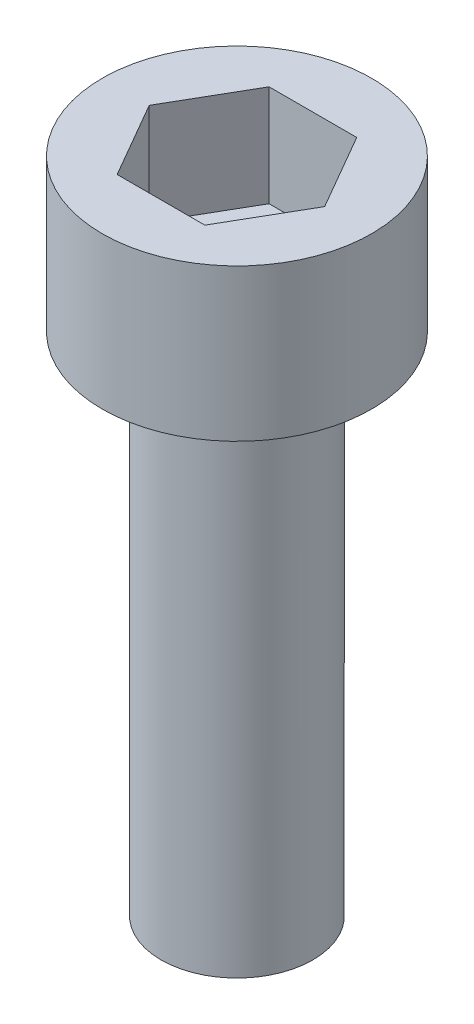
ISO-10303-21;
HEADER;
FILE_DESCRIPTION(('STEP AP214'),'2;1');
FILE_NAME('part.step','',(''),(''),'','','');
FILE_SCHEMA(('AUTOMOTIVE_DESIGN { 1 0 10303 214 1 1 1 1 }'));
ENDSEC;
DATA;
#1=APPLICATION_CONTEXT('core data for automotive mechanical design processes');
#2=APPLICATION_PROTOCOL_DEFINITION('international standard','automotive_design',2000,#1);
#3=PRODUCT_CONTEXT('',#1,'mechanical');
#4=PRODUCT('Part','Part','',(#3));
#5=PRODUCT_RELATED_PRODUCT_CATEGORY('part','',(#4));
#6=PRODUCT_DEFINITION_FORMATION('','',#4);
#7=PRODUCT_DEFINITION_CONTEXT('part definition',#1,'design');
#8=PRODUCT_DEFINITION('design','',#6,#7);
#9=PRODUCT_DEFINITION_SHAPE('','',#8);
#10=(LENGTH_UNIT() NAMED_UNIT(*) SI_UNIT(.MILLI.,.METRE.));
#11=(NAMED_UNIT(*) PLANE_ANGLE_UNIT() SI_UNIT($,.RADIAN.));
#12=(NAMED_UNIT(*) SI_UNIT($,.STERADIAN.) SOLID_ANGLE_UNIT());
#13=UNCERTAINTY_MEASURE_WITH_UNIT(LENGTH_MEASURE(1.E-05),#10,'distance_accuracy_value','');
#14=(GEOMETRIC_REPRESENTATION_CONTEXT(3) GLOBAL_UNCERTAINTY_ASSIGNED_CONTEXT((#13)) GLOBAL_UNIT_ASSIGNED_CONTEXT((#10,
#11,#12)) REPRESENTATION_CONTEXT('',''));
#15=CARTESIAN_POINT('',(0.,0.,0.));
#16=DIRECTION('',(0.,0.,1.));
#17=DIRECTION('',(1.,0.,0.));
#18=AXIS2_PLACEMENT_3D('',#15,#16,#17);
#19=CARTESIAN_POINT('',(0.,3.,0.));
#20=DIRECTION('',(0.,-1.,0.));
#21=DIRECTION('',(0.,0.,-1.));
#22=AXIS2_PLACEMENT_3D('',#19,#20,#21);
#23=CYLINDRICAL_SURFACE('',#22,2.66);
#24=CARTESIAN_POINT('',(0.,3.,0.));
#25=DIRECTION('',(0.,1.,0.));
#26=DIRECTION('',(0.,0.,1.));
#27=AXIS2_PLACEMENT_3D('',#24,#25,#26);
#28=CIRCLE('',#27,2.66);
#29=CARTESIAN_POINT('',(0.,3.,2.66));
#30=VERTEX_POINT('',#29);
#31=EDGE_CURVE('E42',#30,#30,#28,.T.);
#32=ORIENTED_EDGE('',*,*,#31,.F.);
#33=EDGE_LOOP('',(#32));
#34=FACE_BOUND('',#33,.T.);
#35=CARTESIAN_POINT('',(0.,0.,0.));
#36=DIRECTION('',(0.,1.,0.));
#37=DIRECTION('',(0.,0.,1.));
#38=AXIS2_PLACEMENT_3D('',#35,#36,#37);
#39=CIRCLE('',#38,2.66);
#40=CARTESIAN_POINT('',(0.,0.,2.66));
#41=VERTEX_POINT('',#40);
#42=EDGE_CURVE('E137',#41,#41,#39,.T.);
#43=ORIENTED_EDGE('',*,*,#42,.T.);
#44=EDGE_LOOP('',(#43));
#45=FACE_BOUND('',#44,.T.);
#46=ADVANCED_FACE('F35',(#34,#45),#23,.T.);
#47=CARTESIAN_POINT('',(0.,3.,0.));
#48=DIRECTION('',(0.,1.,0.));
#49=DIRECTION('',(0.,0.,1.));
#50=AXIS2_PLACEMENT_3D('',#47,#48,#49);
#51=PLANE('',#50);
#52=DIRECTION('',(0.5,0.,-0.866025403784439));
#53=VECTOR('',#52,1.);
#54=CARTESIAN_POINT('',(0.866025403784438,3.,1.5));
#55=LINE('',#54,#53);
#56=CARTESIAN_POINT('',(0.866025403784438,3.,1.5));
#57=VERTEX_POINT('',#56);
#58=CARTESIAN_POINT('',(1.73205080756888,3.,0.));
#59=VERTEX_POINT('',#58);
#60=EDGE_CURVE('E49',#57,#59,#55,.T.);
#61=ORIENTED_EDGE('',*,*,#60,.F.);
#62=DIRECTION('',(1.,0.,0.));
#63=VECTOR('',#62,1.);
#64=CARTESIAN_POINT('',(-0.866025403784439,3.,1.5));
#65=LINE('',#64,#63);
#66=CARTESIAN_POINT('',(-0.866025403784439,3.,1.5));
#67=VERTEX_POINT('',#66);
#68=EDGE_CURVE('E133',#67,#57,#65,.T.);
#69=ORIENTED_EDGE('',*,*,#68,.F.);
#70=DIRECTION('',(0.5,0.,0.866025403784439));
#71=VECTOR('',#70,1.);
#72=CARTESIAN_POINT('',(-1.73205080756888,3.,0.));
#73=LINE('',#72,#71);
#74=CARTESIAN_POINT('',(-1.73205080756888,3.,0.));
#75=VERTEX_POINT('',#74);
#76=EDGE_CURVE('E131',#75,#67,#73,.T.);
#77=ORIENTED_EDGE('',*,*,#76,.F.);
#78=DIRECTION('',(-0.5,0.,0.866025403784439));
#79=VECTOR('',#78,1.);
#80=CARTESIAN_POINT('',(-0.866025403784439,3.,-1.5));
#81=LINE('',#80,#79);
#82=CARTESIAN_POINT('',(-0.866025403784439,3.,-1.5));
#83=VERTEX_POINT('',#82);
#84=EDGE_CURVE('E97',#83,#75,#81,.T.);
#85=ORIENTED_EDGE('',*,*,#84,.F.);
#86=DIRECTION('',(-1.,0.,0.));
#87=VECTOR('',#86,1.);
#88=CARTESIAN_POINT('',(0.866025403784438,3.,-1.5));
#89=LINE('',#88,#87);
#90=CARTESIAN_POINT('',(0.866025403784438,3.,-1.5));
#91=VERTEX_POINT('',#90);
#92=EDGE_CURVE('E127',#91,#83,#89,.T.);
#93=ORIENTED_EDGE('',*,*,#92,.F.);
#94=DIRECTION('',(-0.5,0.,-0.866025403784439));
#95=VECTOR('',#94,1.);
#96=CARTESIAN_POINT('',(1.73205080756888,3.,0.));
#97=LINE('',#96,#95);
#98=EDGE_CURVE('E123',#59,#91,#97,.T.);
#99=ORIENTED_EDGE('',*,*,#98,.F.);
#100=EDGE_LOOP('',(#61,#69,#77,#85,#93,#99));
#101=FACE_BOUND('',#100,.T.);
#102=ORIENTED_EDGE('',*,*,#31,.T.);
#103=EDGE_LOOP('',(#102));
#104=FACE_BOUND('',#103,.T.);
#105=ADVANCED_FACE('F151',(#101,#104),#51,.T.);
#106=CARTESIAN_POINT('',(0.,0.,0.));
#107=DIRECTION('',(0.,1.,0.));
#108=DIRECTION('',(0.,0.,1.));
#109=AXIS2_PLACEMENT_3D('',#106,#107,#108);
#110=PLANE('',#109);
#111=CARTESIAN_POINT('',(0.,0.,0.));
#112=DIRECTION('',(0.,1.,0.));
#113=DIRECTION('',(0.,0.,1.));
#114=AXIS2_PLACEMENT_3D('',#111,#112,#113);
#115=CIRCLE('',#114,1.5);
#116=CARTESIAN_POINT('',(0.,0.,1.5));
#117=VERTEX_POINT('',#116);
#118=EDGE_CURVE('E11',#117,#117,#115,.F.);
#119=ORIENTED_EDGE('',*,*,#118,.F.);
#120=EDGE_LOOP('',(#119));
#121=FACE_BOUND('',#120,.T.);
#122=ORIENTED_EDGE('',*,*,#42,.F.);
#123=EDGE_LOOP('',(#122));
#124=FACE_BOUND('',#123,.T.);
#125=ADVANCED_FACE('F148',(#121,#124),#110,.F.);
#126=CARTESIAN_POINT('',(0.866025403784438,1.,1.5));
#127=DIRECTION('',(0.866025403784439,0.,0.5));
#128=DIRECTION('',(0.5,0.,-0.866025403784439));
#129=AXIS2_PLACEMENT_3D('',#126,#127,#128);
#130=PLANE('',#129);
#131=ORIENTED_EDGE('',*,*,#60,.T.);
#132=DIRECTION('',(0.,1.,0.));
#133=VECTOR('',#132,1.);
#134=CARTESIAN_POINT('',(1.73205080756888,1.,0.));
#135=LINE('',#134,#133);
#136=CARTESIAN_POINT('',(1.73205080756888,1.,0.));
#137=VERTEX_POINT('',#136);
#138=EDGE_CURVE('E79',#137,#59,#135,.T.);
#139=ORIENTED_EDGE('',*,*,#138,.F.);
#140=DIRECTION('',(0.5,0.,-0.866025403784439));
#141=VECTOR('',#140,1.);
#142=CARTESIAN_POINT('',(0.866025403784438,1.,1.5));
#143=LINE('',#142,#141);
#144=CARTESIAN_POINT('',(0.866025403784438,1.,1.5));
#145=VERTEX_POINT('',#144);
#146=EDGE_CURVE('E135',#145,#137,#143,.T.);
#147=ORIENTED_EDGE('',*,*,#146,.F.);
#148=DIRECTION('',(0.,1.,0.));
#149=VECTOR('',#148,1.);
#150=CARTESIAN_POINT('',(0.866025403784438,1.,1.5));
#151=LINE('',#150,#149);
#152=EDGE_CURVE('E57',#145,#57,#151,.T.);
#153=ORIENTED_EDGE('',*,*,#152,.T.);
#154=EDGE_LOOP('',(#131,#139,#147,#153));
#155=FACE_BOUND('',#154,.T.);
#156=ADVANCED_FACE('F150',(#155),#130,.F.);
#157=CARTESIAN_POINT('',(-0.866025403784439,1.,1.5));
#158=DIRECTION('',(0.,0.,1.));
#159=DIRECTION('',(1.,0.,0.));
#160=AXIS2_PLACEMENT_3D('',#157,#158,#159);
#161=PLANE('',#160);
#162=ORIENTED_EDGE('',*,*,#68,.T.);
#163=ORIENTED_EDGE('',*,*,#152,.F.);
#164=DIRECTION('',(1.,0.,0.));
#165=VECTOR('',#164,1.);
#166=CARTESIAN_POINT('',(-0.866025403784439,1.,1.5));
#167=LINE('',#166,#165);
#168=CARTESIAN_POINT('',(-0.866025403784439,1.,1.5));
#169=VERTEX_POINT('',#168);
#170=EDGE_CURVE('E109',#169,#145,#167,.T.);
#171=ORIENTED_EDGE('',*,*,#170,.F.);
#172=DIRECTION('',(0.,1.,0.));
#173=VECTOR('',#172,1.);
#174=CARTESIAN_POINT('',(-0.866025403784439,1.,1.5));
#175=LINE('',#174,#173);
#176=EDGE_CURVE('E101',#169,#67,#175,.T.);
#177=ORIENTED_EDGE('',*,*,#176,.T.);
#178=EDGE_LOOP('',(#162,#163,#171,#177));
#179=FACE_BOUND('',#178,.T.);
#180=ADVANCED_FACE('F157',(#179),#161,.F.);
#181=CARTESIAN_POINT('',(-1.73205080756888,1.,0.));
#182=DIRECTION('',(-0.866025403784439,0.,0.5));
#183=DIRECTION('',(0.5,0.,0.866025403784439));
#184=AXIS2_PLACEMENT_3D('',#181,#182,#183);
#185=PLANE('',#184);
#186=ORIENTED_EDGE('',*,*,#76,.T.);
#187=ORIENTED_EDGE('',*,*,#176,.F.);
#188=DIRECTION('',(0.5,0.,0.866025403784439));
#189=VECTOR('',#188,1.);
#190=CARTESIAN_POINT('',(-1.73205080756888,1.,0.));
#191=LINE('',#190,#189);
#192=CARTESIAN_POINT('',(-1.73205080756888,1.,0.));
#193=VERTEX_POINT('',#192);
#194=EDGE_CURVE('E105',#193,#169,#191,.T.);
#195=ORIENTED_EDGE('',*,*,#194,.F.);
#196=DIRECTION('',(0.,1.,0.));
#197=VECTOR('',#196,1.);
#198=CARTESIAN_POINT('',(-1.73205080756888,1.,0.));
#199=LINE('',#198,#197);
#200=EDGE_CURVE('E90',#193,#75,#199,.T.);
#201=ORIENTED_EDGE('',*,*,#200,.T.);
#202=EDGE_LOOP('',(#186,#187,#195,#201));
#203=FACE_BOUND('',#202,.T.);
#204=ADVANCED_FACE('F106',(#203),#185,.F.);
#205=CARTESIAN_POINT('',(-0.866025403784439,1.,-1.5));
#206=DIRECTION('',(-0.866025403784439,0.,-0.5));
#207=DIRECTION('',(-0.5,0.,0.866025403784439));
#208=AXIS2_PLACEMENT_3D('',#205,#206,#207);
#209=PLANE('',#208);
#210=ORIENTED_EDGE('',*,*,#84,.T.);
#211=ORIENTED_EDGE('',*,*,#200,.F.);
#212=DIRECTION('',(-0.5,0.,0.866025403784439));
#213=VECTOR('',#212,1.);
#214=CARTESIAN_POINT('',(-0.866025403784439,1.,-1.5));
#215=LINE('',#214,#213);
#216=CARTESIAN_POINT('',(-0.866025403784439,1.,-1.5));
#217=VERTEX_POINT('',#216);
#218=EDGE_CURVE('E94',#217,#193,#215,.T.);
#219=ORIENTED_EDGE('',*,*,#218,.F.);
#220=DIRECTION('',(0.,1.,0.));
#221=VECTOR('',#220,1.);
#222=CARTESIAN_POINT('',(-0.866025403784439,1.,-1.5));
#223=LINE('',#222,#221);
#224=EDGE_CURVE('E102',#217,#83,#223,.T.);
#225=ORIENTED_EDGE('',*,*,#224,.T.);
#226=EDGE_LOOP('',(#210,#211,#219,#225));
#227=FACE_BOUND('',#226,.T.);
#228=ADVANCED_FACE('F92',(#227),#209,.F.);
#229=CARTESIAN_POINT('',(0.866025403784438,1.,-1.5));
#230=DIRECTION('',(0.,0.,-1.));
#231=DIRECTION('',(-1.,0.,0.));
#232=AXIS2_PLACEMENT_3D('',#229,#230,#231);
#233=PLANE('',#232);
#234=ORIENTED_EDGE('',*,*,#92,.T.);
#235=ORIENTED_EDGE('',*,*,#224,.F.);
#236=DIRECTION('',(-1.,0.,0.));
#237=VECTOR('',#236,1.);
#238=CARTESIAN_POINT('',(0.866025403784438,1.,-1.5));
#239=LINE('',#238,#237);
#240=CARTESIAN_POINT('',(0.866025403784438,1.,-1.5));
#241=VERTEX_POINT('',#240);
#242=EDGE_CURVE('E115',#241,#217,#239,.T.);
#243=ORIENTED_EDGE('',*,*,#242,.F.);
#244=DIRECTION('',(0.,1.,0.));
#245=VECTOR('',#244,1.);
#246=CARTESIAN_POINT('',(0.866025403784438,1.,-1.5));
#247=LINE('',#246,#245);
#248=EDGE_CURVE('E140',#241,#91,#247,.T.);
#249=ORIENTED_EDGE('',*,*,#248,.T.);
#250=EDGE_LOOP('',(#234,#235,#243,#249));
#251=FACE_BOUND('',#250,.T.);
#252=ADVANCED_FACE('F209',(#251),#233,.F.);
#253=CARTESIAN_POINT('',(1.73205080756888,1.,0.));
#254=DIRECTION('',(0.866025403784439,0.,-0.5));
#255=DIRECTION('',(-0.5,0.,-0.866025403784439));
#256=AXIS2_PLACEMENT_3D('',#253,#254,#255);
#257=PLANE('',#256);
#258=ORIENTED_EDGE('',*,*,#98,.T.);
#259=ORIENTED_EDGE('',*,*,#248,.F.);
#260=DIRECTION('',(-0.5,0.,-0.866025403784439));
#261=VECTOR('',#260,1.);
#262=CARTESIAN_POINT('',(1.73205080756888,1.,0.));
#263=LINE('',#262,#261);
#264=EDGE_CURVE('E117',#137,#241,#263,.T.);
#265=ORIENTED_EDGE('',*,*,#264,.F.);
#266=ORIENTED_EDGE('',*,*,#138,.T.);
#267=EDGE_LOOP('',(#258,#259,#265,#266));
#268=FACE_BOUND('',#267,.T.);
#269=ADVANCED_FACE('F218',(#268),#257,.F.);
#270=CARTESIAN_POINT('',(0.,1.,0.));
#271=DIRECTION('',(0.,1.,0.));
#272=DIRECTION('',(0.,0.,1.));
#273=AXIS2_PLACEMENT_3D('',#270,#271,#272);
#274=PLANE('',#273);
#275=ORIENTED_EDGE('',*,*,#146,.T.);
#276=ORIENTED_EDGE('',*,*,#264,.T.);
#277=ORIENTED_EDGE('',*,*,#242,.T.);
#278=ORIENTED_EDGE('',*,*,#218,.T.);
#279=ORIENTED_EDGE('',*,*,#194,.T.);
#280=ORIENTED_EDGE('',*,*,#170,.T.);
#281=EDGE_LOOP('',(#275,#276,#277,#278,#279,#280));
#282=FACE_BOUND('',#281,.T.);
#283=ADVANCED_FACE('F112',(#282),#274,.T.);
#284=CARTESIAN_POINT('',(0.,-10.,0.));
#285=DIRECTION('',(0.,1.,0.));
#286=DIRECTION('',(0.,0.,1.));
#287=AXIS2_PLACEMENT_3D('',#284,#285,#286);
#288=CYLINDRICAL_SURFACE('',#287,1.5);
#289=CARTESIAN_POINT('',(0.,-10.,0.));
#290=DIRECTION('',(0.,-1.,0.));
#291=DIRECTION('',(0.,0.,-1.));
#292=AXIS2_PLACEMENT_3D('',#289,#290,#291);
#293=CIRCLE('',#292,1.5);
#294=CARTESIAN_POINT('',(0.,-10.,-1.5));
#295=VERTEX_POINT('',#294);
#296=EDGE_CURVE('E124',#295,#295,#293,.T.);
#297=ORIENTED_EDGE('',*,*,#296,.F.);
#298=EDGE_LOOP('',(#297));
#299=FACE_BOUND('',#298,.T.);
#300=ORIENTED_EDGE('',*,*,#118,.T.);
#301=EDGE_LOOP('',(#300));
#302=FACE_BOUND('',#301,.T.);
#303=ADVANCED_FACE('F236',(#299,#302),#288,.T.);
#304=CARTESIAN_POINT('',(0.,-10.,0.));
#305=DIRECTION('',(0.,-1.,0.));
#306=DIRECTION('',(0.,0.,-1.));
#307=AXIS2_PLACEMENT_3D('',#304,#305,#306);
#308=PLANE('',#307);
#309=ORIENTED_EDGE('',*,*,#296,.T.);
#310=EDGE_LOOP('',(#309));
#311=FACE_BOUND('',#310,.T.);
#312=ADVANCED_FACE('F244',(#311),#308,.T.);
#313=CLOSED_SHELL('',(#46,#105,#125,#156,#180,#204,#228,#252,#269,#283,#303,#312));
#314=MANIFOLD_SOLID_BREP('B2',#313);
#315=ADVANCED_BREP_SHAPE_REPRESENTATION('',(#18,#314),#14);
#316=SHAPE_DEFINITION_REPRESENTATION(#9,#315);
ENDSEC;
END-ISO-10303-21;
